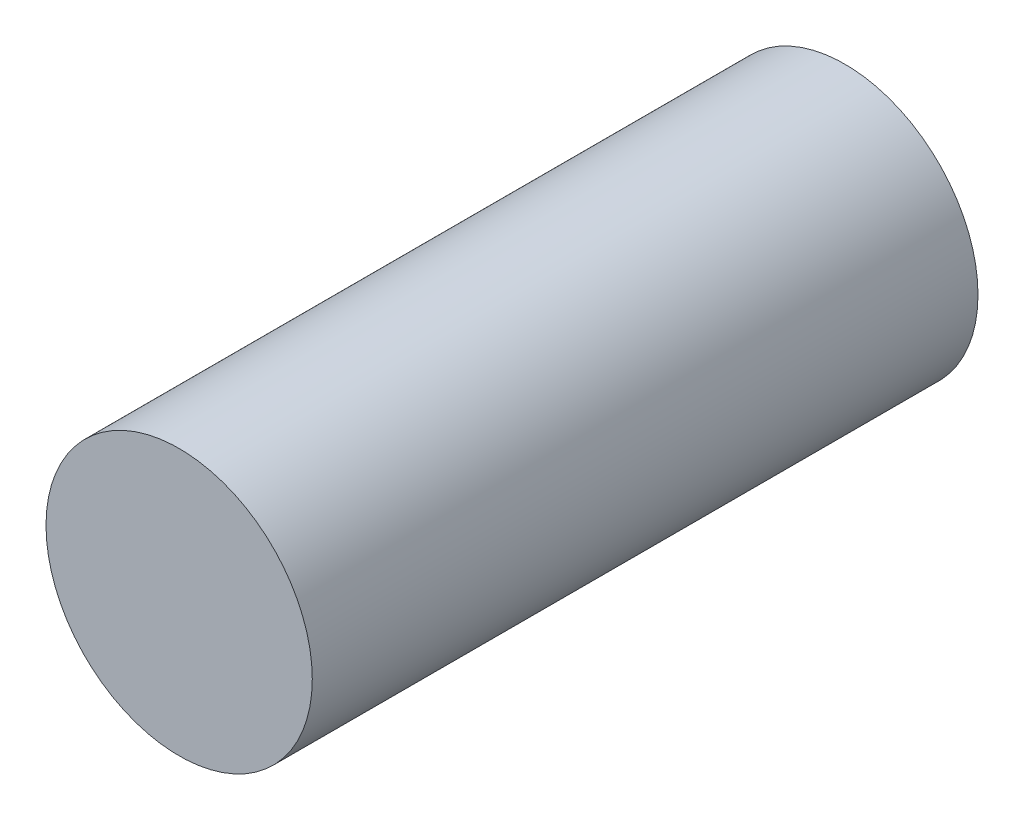
ISO-10303-21;
HEADER;
FILE_DESCRIPTION(('STEP AP214'),'2;1');
FILE_NAME('part.step','',(''),(''),'','','');
FILE_SCHEMA(('AUTOMOTIVE_DESIGN { 1 0 10303 214 1 1 1 1 }'));
ENDSEC;
DATA;
#1=APPLICATION_CONTEXT('core data for automotive mechanical design processes');
#2=APPLICATION_PROTOCOL_DEFINITION('international standard','automotive_design',2000,#1);
#3=PRODUCT_CONTEXT('',#1,'mechanical');
#4=PRODUCT('Part','Part','',(#3));
#5=PRODUCT_RELATED_PRODUCT_CATEGORY('part','',(#4));
#6=PRODUCT_DEFINITION_FORMATION('','',#4);
#7=PRODUCT_DEFINITION_CONTEXT('part definition',#1,'design');
#8=PRODUCT_DEFINITION('design','',#6,#7);
#9=PRODUCT_DEFINITION_SHAPE('','',#8);
#10=(LENGTH_UNIT() NAMED_UNIT(*) SI_UNIT(.MILLI.,.METRE.));
#11=(NAMED_UNIT(*) PLANE_ANGLE_UNIT() SI_UNIT($,.RADIAN.));
#12=(NAMED_UNIT(*) SI_UNIT($,.STERADIAN.) SOLID_ANGLE_UNIT());
#13=UNCERTAINTY_MEASURE_WITH_UNIT(LENGTH_MEASURE(1.E-05),#10,'distance_accuracy_value','');
#14=(GEOMETRIC_REPRESENTATION_CONTEXT(3) GLOBAL_UNCERTAINTY_ASSIGNED_CONTEXT((#13)) GLOBAL_UNIT_ASSIGNED_CONTEXT((#10,
#11,#12)) REPRESENTATION_CONTEXT('',''));
#15=CARTESIAN_POINT('',(0.,0.,0.));
#16=DIRECTION('',(0.,0.,1.));
#17=DIRECTION('',(1.,0.,0.));
#18=AXIS2_PLACEMENT_3D('',#15,#16,#17);
#19=CARTESIAN_POINT('',(0.,0.,-10.));
#20=DIRECTION('',(0.,0.,1.));
#21=DIRECTION('',(1.,0.,0.));
#22=AXIS2_PLACEMENT_3D('',#19,#20,#21);
#23=CYLINDRICAL_SURFACE('',#22,1.5);
#24=CARTESIAN_POINT('',(0.,0.,-10.));
#25=DIRECTION('',(0.,0.,1.));
#26=DIRECTION('',(1.,0.,0.));
#27=AXIS2_PLACEMENT_3D('',#24,#25,#26);
#28=CIRCLE('',#27,1.5);
#29=CARTESIAN_POINT('',(1.5,0.,-10.));
#30=VERTEX_POINT('',#29);
#31=EDGE_CURVE('E51',#30,#30,#28,.T.);
#32=ORIENTED_EDGE('',*,*,#31,.F.);
#33=EDGE_LOOP('',(#32));
#34=FACE_BOUND('',#33,.T.);
#35=CARTESIAN_POINT('',(0.,0.,-2.));
#36=DIRECTION('',(0.,0.,1.));
#37=DIRECTION('',(1.,0.,0.));
#38=AXIS2_PLACEMENT_3D('',#35,#36,#37);
#39=CIRCLE('',#38,1.5);
#40=CARTESIAN_POINT('',(1.5,0.,-2.));
#41=VERTEX_POINT('',#40);
#42=EDGE_CURVE('E10',#41,#41,#39,.F.);
#43=ORIENTED_EDGE('',*,*,#42,.F.);
#44=EDGE_LOOP('',(#43));
#45=FACE_BOUND('',#44,.T.);
#46=ADVANCED_FACE('F35',(#34,#45),#23,.F.);
#47=CARTESIAN_POINT('',(0.,0.,-10.));
#48=DIRECTION('',(0.,0.,1.));
#49=DIRECTION('',(1.,0.,0.));
#50=AXIS2_PLACEMENT_3D('',#47,#48,#49);
#51=CYLINDRICAL_SURFACE('',#50,2.);
#52=CARTESIAN_POINT('',(0.,0.,0.));
#53=DIRECTION('',(0.,0.,1.));
#54=DIRECTION('',(1.,0.,0.));
#55=AXIS2_PLACEMENT_3D('',#52,#53,#54);
#56=CIRCLE('',#55,2.);
#57=CARTESIAN_POINT('',(2.,0.,0.));
#58=VERTEX_POINT('',#57);
#59=EDGE_CURVE('E46',#58,#58,#56,.T.);
#60=ORIENTED_EDGE('',*,*,#59,.F.);
#61=EDGE_LOOP('',(#60));
#62=FACE_BOUND('',#61,.T.);
#63=CARTESIAN_POINT('',(0.,0.,-10.));
#64=DIRECTION('',(0.,0.,1.));
#65=DIRECTION('',(1.,0.,0.));
#66=AXIS2_PLACEMENT_3D('',#63,#64,#65);
#67=CIRCLE('',#66,2.);
#68=CARTESIAN_POINT('',(2.,0.,-10.));
#69=VERTEX_POINT('',#68);
#70=EDGE_CURVE('E42',#69,#69,#67,.T.);
#71=ORIENTED_EDGE('',*,*,#70,.T.);
#72=EDGE_LOOP('',(#71));
#73=FACE_BOUND('',#72,.T.);
#74=ADVANCED_FACE('F37',(#62,#73),#51,.T.);
#75=CARTESIAN_POINT('',(0.,0.,-10.));
#76=DIRECTION('',(0.,0.,1.));
#77=DIRECTION('',(1.,0.,0.));
#78=AXIS2_PLACEMENT_3D('',#75,#76,#77);
#79=PLANE('',#78);
#80=ORIENTED_EDGE('',*,*,#31,.T.);
#81=EDGE_LOOP('',(#80));
#82=FACE_BOUND('',#81,.T.);
#83=ORIENTED_EDGE('',*,*,#70,.F.);
#84=EDGE_LOOP('',(#83));
#85=FACE_BOUND('',#84,.T.);
#86=ADVANCED_FACE('F56',(#82,#85),#79,.F.);
#87=CARTESIAN_POINT('',(0.,0.,0.));
#88=DIRECTION('',(0.,0.,1.));
#89=DIRECTION('',(1.,0.,0.));
#90=AXIS2_PLACEMENT_3D('',#87,#88,#89);
#91=PLANE('',#90);
#92=ORIENTED_EDGE('',*,*,#59,.T.);
#93=EDGE_LOOP('',(#92));
#94=FACE_BOUND('',#93,.T.);
#95=ADVANCED_FACE('F70',(#94),#91,.T.);
#96=CARTESIAN_POINT('',(0.,0.,-2.));
#97=DIRECTION('',(0.,0.,1.));
#98=DIRECTION('',(1.,0.,0.));
#99=AXIS2_PLACEMENT_3D('',#96,#97,#98);
#100=PLANE('',#99);
#101=ORIENTED_EDGE('',*,*,#42,.T.);
#102=EDGE_LOOP('',(#101));
#103=FACE_BOUND('',#102,.T.);
#104=ADVANCED_FACE('F68',(#103),#100,.F.);
#105=CLOSED_SHELL('',(#46,#74,#86,#95,#104));
#106=MANIFOLD_SOLID_BREP('B2',#105);
#107=ADVANCED_BREP_SHAPE_REPRESENTATION('',(#18,#106),#14);
#108=SHAPE_DEFINITION_REPRESENTATION(#9,#107);
ENDSEC;
END-ISO-10303-21;
